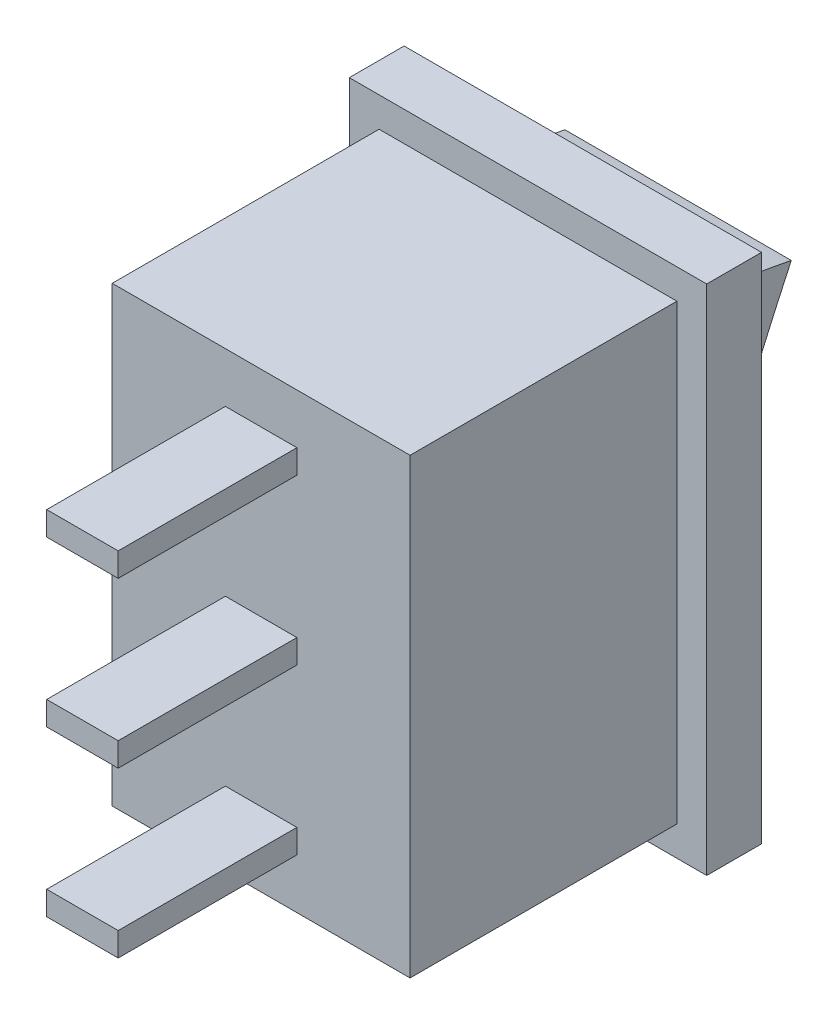
ISO-10303-21;
HEADER;
FILE_DESCRIPTION(('STEP AP214'),'2;1');
FILE_NAME('part.step','',(''),(''),'','','');
FILE_SCHEMA(('AUTOMOTIVE_DESIGN { 1 0 10303 214 1 1 1 1 }'));
ENDSEC;
DATA;
#1=APPLICATION_CONTEXT('core data for automotive mechanical design processes');
#2=APPLICATION_PROTOCOL_DEFINITION('international standard','automotive_design',2000,#1);
#3=PRODUCT_CONTEXT('',#1,'mechanical');
#4=PRODUCT('Part','Part','',(#3));
#5=PRODUCT_RELATED_PRODUCT_CATEGORY('part','',(#4));
#6=PRODUCT_DEFINITION_FORMATION('','',#4);
#7=PRODUCT_DEFINITION_CONTEXT('part definition',#1,'design');
#8=PRODUCT_DEFINITION('design','',#6,#7);
#9=PRODUCT_DEFINITION_SHAPE('','',#8);
#10=(LENGTH_UNIT() NAMED_UNIT(*) SI_UNIT(.MILLI.,.METRE.));
#11=(NAMED_UNIT(*) PLANE_ANGLE_UNIT() SI_UNIT($,.RADIAN.));
#12=(NAMED_UNIT(*) SI_UNIT($,.STERADIAN.) SOLID_ANGLE_UNIT());
#13=UNCERTAINTY_MEASURE_WITH_UNIT(LENGTH_MEASURE(1.E-05),#10,'distance_accuracy_value','');
#14=(GEOMETRIC_REPRESENTATION_CONTEXT(3) GLOBAL_UNCERTAINTY_ASSIGNED_CONTEXT((#13)) GLOBAL_UNIT_ASSIGNED_CONTEXT((#10,
#11,#12)) REPRESENTATION_CONTEXT('',''));
#15=CARTESIAN_POINT('',(0.,0.,0.));
#16=DIRECTION('',(0.,0.,1.));
#17=DIRECTION('',(1.,0.,0.));
#18=AXIS2_PLACEMENT_3D('',#15,#16,#17);
#19=CARTESIAN_POINT('',(-6.25,-9.5,13.5));
#20=DIRECTION('',(0.,0.,1.));
#21=DIRECTION('',(1.,0.,0.));
#22=AXIS2_PLACEMENT_3D('',#19,#20,#21);
#23=PLANE('',#22);
#24=DIRECTION('',(0.,1.,0.));
#25=VECTOR('',#24,1.);
#26=CARTESIAN_POINT('',(1.49999999999998,-7.4,13.5));
#27=LINE('',#26,#25);
#28=CARTESIAN_POINT('',(1.49999999999998,-7.4,13.5));
#29=VERTEX_POINT('',#28);
#30=CARTESIAN_POINT('',(1.49999999999998,-6.4,13.5));
#31=VERTEX_POINT('',#30);
#32=EDGE_CURVE('E225',#29,#31,#27,.T.);
#33=ORIENTED_EDGE('',*,*,#32,.F.);
#34=DIRECTION('',(1.,0.,0.));
#35=VECTOR('',#34,1.);
#36=CARTESIAN_POINT('',(-1.50000000000002,-7.4,13.5));
#37=LINE('',#36,#35);
#38=CARTESIAN_POINT('',(-1.50000000000002,-7.4,13.5));
#39=VERTEX_POINT('',#38);
#40=EDGE_CURVE('E222',#39,#29,#37,.T.);
#41=ORIENTED_EDGE('',*,*,#40,.F.);
#42=DIRECTION('',(0.,-1.,0.));
#43=VECTOR('',#42,1.);
#44=CARTESIAN_POINT('',(-1.50000000000002,-7.4,13.5));
#45=LINE('',#44,#43);
#46=CARTESIAN_POINT('',(-1.50000000000002,-6.4,13.5));
#47=VERTEX_POINT('',#46);
#48=EDGE_CURVE('E234',#47,#39,#45,.T.);
#49=ORIENTED_EDGE('',*,*,#48,.F.);
#50=DIRECTION('',(-1.,0.,0.));
#51=VECTOR('',#50,1.);
#52=CARTESIAN_POINT('',(-1.50000000000002,-6.4,13.5));
#53=LINE('',#52,#51);
#54=EDGE_CURVE('E242',#31,#47,#53,.T.);
#55=ORIENTED_EDGE('',*,*,#54,.F.);
#56=EDGE_LOOP('',(#33,#41,#49,#55));
#57=FACE_BOUND('',#56,.T.);
#58=DIRECTION('',(0.,-1.,0.));
#59=VECTOR('',#58,1.);
#60=CARTESIAN_POINT('',(-6.25,-9.5,13.5));
#61=LINE('',#60,#59);
#62=CARTESIAN_POINT('',(-6.25,9.5,13.5));
#63=VERTEX_POINT('',#62);
#64=CARTESIAN_POINT('',(-6.25,-9.5,13.5));
#65=VERTEX_POINT('',#64);
#66=EDGE_CURVE('E422',#63,#65,#61,.T.);
#67=ORIENTED_EDGE('',*,*,#66,.T.);
#68=DIRECTION('',(1.,0.,0.));
#69=VECTOR('',#68,1.);
#70=CARTESIAN_POINT('',(6.25000000000001,-9.5,13.5));
#71=LINE('',#70,#69);
#72=CARTESIAN_POINT('',(6.25000000000001,-9.5,13.5));
#73=VERTEX_POINT('',#72);
#74=EDGE_CURVE('E431',#65,#73,#71,.T.);
#75=ORIENTED_EDGE('',*,*,#74,.T.);
#76=DIRECTION('',(0.,1.,0.));
#77=VECTOR('',#76,1.);
#78=CARTESIAN_POINT('',(6.25,9.5,13.5));
#79=LINE('',#78,#77);
#80=CARTESIAN_POINT('',(6.25,9.5,13.5));
#81=VERTEX_POINT('',#80);
#82=EDGE_CURVE('E430',#73,#81,#79,.T.);
#83=ORIENTED_EDGE('',*,*,#82,.T.);
#84=DIRECTION('',(-1.,0.,0.));
#85=VECTOR('',#84,1.);
#86=CARTESIAN_POINT('',(-6.25,9.5,13.5));
#87=LINE('',#86,#85);
#88=EDGE_CURVE('E425',#81,#63,#87,.T.);
#89=ORIENTED_EDGE('',*,*,#88,.T.);
#90=EDGE_LOOP('',(#67,#75,#83,#89));
#91=FACE_BOUND('',#90,.T.);
#92=DIRECTION('',(1.,0.,0.));
#93=VECTOR('',#92,1.);
#94=CARTESIAN_POINT('',(-1.5,-0.5,13.5));
#95=LINE('',#94,#93);
#96=CARTESIAN_POINT('',(-1.5,-0.5,13.5));
#97=VERTEX_POINT('',#96);
#98=CARTESIAN_POINT('',(1.5,-0.5,13.5));
#99=VERTEX_POINT('',#98);
#100=EDGE_CURVE('E267',#97,#99,#95,.T.);
#101=ORIENTED_EDGE('',*,*,#100,.F.);
#102=DIRECTION('',(0.,-1.,0.));
#103=VECTOR('',#102,1.);
#104=CARTESIAN_POINT('',(-1.5,0.5,13.5));
#105=LINE('',#104,#103);
#106=CARTESIAN_POINT('',(-1.5,0.5,13.5));
#107=VERTEX_POINT('',#106);
#108=EDGE_CURVE('E253',#107,#97,#105,.T.);
#109=ORIENTED_EDGE('',*,*,#108,.F.);
#110=DIRECTION('',(-1.,0.,0.));
#111=VECTOR('',#110,1.);
#112=CARTESIAN_POINT('',(-1.5,0.5,13.5));
#113=LINE('',#112,#111);
#114=CARTESIAN_POINT('',(1.5,0.500000000000001,13.5));
#115=VERTEX_POINT('',#114);
#116=EDGE_CURVE('E258',#115,#107,#113,.T.);
#117=ORIENTED_EDGE('',*,*,#116,.F.);
#118=DIRECTION('',(0.,1.,0.));
#119=VECTOR('',#118,1.);
#120=CARTESIAN_POINT('',(1.5,0.5,13.5));
#121=LINE('',#120,#119);
#122=EDGE_CURVE('E269',#99,#115,#121,.T.);
#123=ORIENTED_EDGE('',*,*,#122,.F.);
#124=EDGE_LOOP('',(#101,#109,#117,#123));
#125=FACE_BOUND('',#124,.T.);
#126=DIRECTION('',(1.,0.,0.));
#127=VECTOR('',#126,1.);
#128=CARTESIAN_POINT('',(-1.50000000000002,6.4,13.5));
#129=LINE('',#128,#127);
#130=CARTESIAN_POINT('',(-1.50000000000002,6.4,13.5));
#131=VERTEX_POINT('',#130);
#132=CARTESIAN_POINT('',(1.49999999999998,6.4,13.5));
#133=VERTEX_POINT('',#132);
#134=EDGE_CURVE('E501',#131,#133,#129,.T.);
#135=ORIENTED_EDGE('',*,*,#134,.F.);
#136=DIRECTION('',(0.,-1.,0.));
#137=VECTOR('',#136,1.);
#138=CARTESIAN_POINT('',(-1.50000000000002,7.4,13.5));
#139=LINE('',#138,#137);
#140=CARTESIAN_POINT('',(-1.50000000000002,7.4,13.5));
#141=VERTEX_POINT('',#140);
#142=EDGE_CURVE('E220',#141,#131,#139,.T.);
#143=ORIENTED_EDGE('',*,*,#142,.F.);
#144=DIRECTION('',(-1.,0.,0.));
#145=VECTOR('',#144,1.);
#146=CARTESIAN_POINT('',(-1.50000000000002,7.4,13.5));
#147=LINE('',#146,#145);
#148=CARTESIAN_POINT('',(1.49999999999998,7.4,13.5));
#149=VERTEX_POINT('',#148);
#150=EDGE_CURVE('E216',#149,#141,#147,.T.);
#151=ORIENTED_EDGE('',*,*,#150,.F.);
#152=DIRECTION('',(0.,1.,0.));
#153=VECTOR('',#152,1.);
#154=CARTESIAN_POINT('',(1.49999999999998,7.4,13.5));
#155=LINE('',#154,#153);
#156=EDGE_CURVE('E503',#133,#149,#155,.T.);
#157=ORIENTED_EDGE('',*,*,#156,.F.);
#158=EDGE_LOOP('',(#135,#143,#151,#157));
#159=FACE_BOUND('',#158,.T.);
#160=ADVANCED_FACE('F35',(#57,#91,#125,#159),#23,.T.);
#161=CARTESIAN_POINT('',(4.75,7.5,-4.));
#162=DIRECTION('',(-1.,0.,0.));
#163=DIRECTION('',(0.,-1.,0.));
#164=AXIS2_PLACEMENT_3D('',#161,#162,#163);
#165=PLANE('',#164);
#166=CARTESIAN_POINT('',(4.75,-7.5,-0.355698538172021));
#167=CARTESIAN_POINT('',(4.75,-7.20358473254136,-0.354349181532763));
#168=CARTESIAN_POINT('',(4.75,-4.68700606925858,-0.342893084292468));
#169=CARTESIAN_POINT('',(4.75,0.423075598671808,-0.90591646987989));
#170=CARTESIAN_POINT('',(4.75,4.76511014941746,-2.92374207641146));
#171=CARTESIAN_POINT('',(4.75,7.08104323828726,-4.));
#172=B_SPLINE_CURVE_WITH_KNOTS('',3,(#166,#167,#168,#169,#170,#171),.UNSPECIFIED.,.F.,.F.,(4,1,
1,4),(0.,0.0586457613073711,0.497905093969898,1.),.UNSPECIFIED.);
#173=CARTESIAN_POINT('',(4.75,7.08104323828726,-4.));
#174=VERTEX_POINT('',#173);
#175=CARTESIAN_POINT('',(4.74999999999999,-7.5,-0.355698538172021));
#176=VERTEX_POINT('',#175);
#177=EDGE_CURVE('E455',#174,#176,#172,.F.);
#178=ORIENTED_EDGE('',*,*,#177,.F.);
#179=CARTESIAN_POINT('',(4.75,7.08104323828726,-4.));
#180=CARTESIAN_POINT('',(4.75,7.19501669015073,-3.41831864187691));
#181=CARTESIAN_POINT('',(4.75,7.45366483827933,-2.09826731747113));
#182=CARTESIAN_POINT('',(4.75,7.48337925673809,-0.75266301192165));
#183=CARTESIAN_POINT('',(4.75,7.5,0.));
#184=B_SPLINE_CURVE_WITH_KNOTS('',3,(#179,#180,#181,#182,#183),.UNSPECIFIED.,.F.,.F.,(4,1,4),
(0.,0.440650562117295,1.),.UNSPECIFIED.);
#185=CARTESIAN_POINT('',(4.75,7.5,0.));
#186=VERTEX_POINT('',#185);
#187=EDGE_CURVE('E468',#186,#174,#184,.F.);
#188=ORIENTED_EDGE('',*,*,#187,.F.);
#189=DIRECTION('',(0.,-1.,0.));
#190=VECTOR('',#189,1.);
#191=CARTESIAN_POINT('',(4.75,7.5,0.));
#192=LINE('',#191,#190);
#193=CARTESIAN_POINT('',(4.74999999999999,-7.5,0.));
#194=VERTEX_POINT('',#193);
#195=EDGE_CURVE('E452',#186,#194,#192,.T.);
#196=ORIENTED_EDGE('',*,*,#195,.T.);
#197=DIRECTION('',(0.,0.,1.));
#198=VECTOR('',#197,1.);
#199=CARTESIAN_POINT('',(4.74999999999999,-7.5,-4.));
#200=LINE('',#199,#198);
#201=EDGE_CURVE('E417',#176,#194,#200,.T.);
#202=ORIENTED_EDGE('',*,*,#201,.F.);
#203=EDGE_LOOP('',(#178,#188,#196,#202));
#204=FACE_BOUND('',#203,.T.);
#205=ADVANCED_FACE('F315',(#204),#165,.F.);
#206=CARTESIAN_POINT('',(4.74999999999999,-7.5,-4.));
#207=DIRECTION('',(0.,1.,0.));
#208=DIRECTION('',(-1.,0.,0.));
#209=AXIS2_PLACEMENT_3D('',#206,#207,#208);
#210=PLANE('',#209);
#211=DIRECTION('',(1.,0.,0.));
#212=VECTOR('',#211,1.);
#213=CARTESIAN_POINT('',(-47.5872937811862,-7.49999999999999,-0.355698538172021));
#214=LINE('',#213,#212);
#215=CARTESIAN_POINT('',(-4.75,-7.5,-0.355698538172021));
#216=VERTEX_POINT('',#215);
#217=EDGE_CURVE('E484',#216,#176,#214,.T.);
#218=ORIENTED_EDGE('',*,*,#217,.T.);
#219=ORIENTED_EDGE('',*,*,#201,.T.);
#220=DIRECTION('',(-1.,0.,0.));
#221=VECTOR('',#220,1.);
#222=CARTESIAN_POINT('',(4.74999999999999,-7.5,0.));
#223=LINE('',#222,#221);
#224=CARTESIAN_POINT('',(-4.75,-7.5,0.));
#225=VERTEX_POINT('',#224);
#226=EDGE_CURVE('E449',#194,#225,#223,.T.);
#227=ORIENTED_EDGE('',*,*,#226,.T.);
#228=DIRECTION('',(0.,0.,1.));
#229=VECTOR('',#228,1.);
#230=CARTESIAN_POINT('',(-4.75,-7.5,-4.));
#231=LINE('',#230,#229);
#232=EDGE_CURVE('E441',#216,#225,#231,.T.);
#233=ORIENTED_EDGE('',*,*,#232,.F.);
#234=EDGE_LOOP('',(#218,#219,#227,#233));
#235=FACE_BOUND('',#234,.T.);
#236=ADVANCED_FACE('F311',(#235),#210,.F.);
#237=CARTESIAN_POINT('',(-4.75,7.5,-4.));
#238=DIRECTION('',(1.,0.,0.));
#239=DIRECTION('',(0.,1.,0.));
#240=AXIS2_PLACEMENT_3D('',#237,#238,#239);
#241=PLANE('',#240);
#242=CARTESIAN_POINT('',(-4.75,-7.5,-0.355698538172021));
#243=CARTESIAN_POINT('',(-4.75,-7.20358473254136,-0.354349181532763));
#244=CARTESIAN_POINT('',(-4.75,-4.68700606925858,-0.342893084292468));
#245=CARTESIAN_POINT('',(-4.75,0.423075598671809,-0.90591646987989));
#246=CARTESIAN_POINT('',(-4.75,4.76511014941746,-2.92374207641146));
#247=CARTESIAN_POINT('',(-4.75,7.08104323828726,-4.));
#248=B_SPLINE_CURVE_WITH_KNOTS('',3,(#242,#243,#244,#245,#246,#247),.UNSPECIFIED.,.F.,.F.,(4,1,
1,4),(0.,0.0586457613073711,0.497905093969898,1.),.UNSPECIFIED.);
#249=CARTESIAN_POINT('',(-4.75,7.08104323828726,-4.));
#250=VERTEX_POINT('',#249);
#251=EDGE_CURVE('E460',#216,#250,#248,.T.);
#252=ORIENTED_EDGE('',*,*,#251,.F.);
#253=ORIENTED_EDGE('',*,*,#232,.T.);
#254=DIRECTION('',(0.,1.,0.));
#255=VECTOR('',#254,1.);
#256=CARTESIAN_POINT('',(-4.75,7.5,0.));
#257=LINE('',#256,#255);
#258=CARTESIAN_POINT('',(-4.75,7.5,0.));
#259=VERTEX_POINT('',#258);
#260=EDGE_CURVE('E446',#225,#259,#257,.T.);
#261=ORIENTED_EDGE('',*,*,#260,.T.);
#262=CARTESIAN_POINT('',(-4.75,7.08104323828726,-4.));
#263=CARTESIAN_POINT('',(-4.75,7.19501669015073,-3.41831864187691));
#264=CARTESIAN_POINT('',(-4.75,7.45366483827933,-2.09826731747113));
#265=CARTESIAN_POINT('',(-4.75,7.48337925673809,-0.75266301192165));
#266=CARTESIAN_POINT('',(-4.75,7.5,0.));
#267=B_SPLINE_CURVE_WITH_KNOTS('',3,(#262,#263,#264,#265,#266),.UNSPECIFIED.,.F.,.F.,(4,1,4),
(0.,0.440650562117295,1.),.UNSPECIFIED.);
#268=EDGE_CURVE('E476',#250,#259,#267,.T.);
#269=ORIENTED_EDGE('',*,*,#268,.F.);
#270=EDGE_LOOP('',(#252,#253,#261,#269));
#271=FACE_BOUND('',#270,.T.);
#272=ADVANCED_FACE('F307',(#271),#241,.F.);
#273=CARTESIAN_POINT('',(-7.5,-10.75,0.));
#274=DIRECTION('',(0.,0.,1.));
#275=DIRECTION('',(1.,0.,0.));
#276=AXIS2_PLACEMENT_3D('',#273,#274,#275);
#277=PLANE('',#276);
#278=ORIENTED_EDGE('',*,*,#195,.F.);
#279=DIRECTION('',(1.,0.,0.));
#280=VECTOR('',#279,1.);
#281=CARTESIAN_POINT('',(4.75,7.5,0.));
#282=LINE('',#281,#280);
#283=EDGE_CURVE('E443',#259,#186,#282,.T.);
#284=ORIENTED_EDGE('',*,*,#283,.F.);
#285=ORIENTED_EDGE('',*,*,#260,.F.);
#286=ORIENTED_EDGE('',*,*,#226,.F.);
#287=EDGE_LOOP('',(#278,#284,#285,#286));
#288=FACE_BOUND('',#287,.T.);
#289=DIRECTION('',(-1.,0.,0.));
#290=VECTOR('',#289,1.);
#291=CARTESIAN_POINT('',(-7.5,10.75,0.));
#292=LINE('',#291,#290);
#293=CARTESIAN_POINT('',(7.5,10.75,0.));
#294=VERTEX_POINT('',#293);
#295=CARTESIAN_POINT('',(-7.5,10.75,0.));
#296=VERTEX_POINT('',#295);
#297=EDGE_CURVE('E376',#294,#296,#292,.T.);
#298=ORIENTED_EDGE('',*,*,#297,.F.);
#299=DIRECTION('',(0.,1.,0.));
#300=VECTOR('',#299,1.);
#301=CARTESIAN_POINT('',(7.5,10.75,0.));
#302=LINE('',#301,#300);
#303=CARTESIAN_POINT('',(7.50000000000002,-10.75,0.));
#304=VERTEX_POINT('',#303);
#305=EDGE_CURVE('E368',#304,#294,#302,.T.);
#306=ORIENTED_EDGE('',*,*,#305,.F.);
#307=DIRECTION('',(1.,0.,0.));
#308=VECTOR('',#307,1.);
#309=CARTESIAN_POINT('',(7.50000000000002,-10.75,0.));
#310=LINE('',#309,#308);
#311=CARTESIAN_POINT('',(-7.5,-10.75,0.));
#312=VERTEX_POINT('',#311);
#313=EDGE_CURVE('E361',#312,#304,#310,.T.);
#314=ORIENTED_EDGE('',*,*,#313,.F.);
#315=DIRECTION('',(0.,-1.,0.));
#316=VECTOR('',#315,1.);
#317=CARTESIAN_POINT('',(-7.5,-10.75,0.));
#318=LINE('',#317,#316);
#319=EDGE_CURVE('E369',#296,#312,#318,.T.);
#320=ORIENTED_EDGE('',*,*,#319,.F.);
#321=EDGE_LOOP('',(#298,#306,#314,#320));
#322=FACE_BOUND('',#321,.T.);
#323=ADVANCED_FACE('F310',(#288,#322),#277,.F.);
#324=CARTESIAN_POINT('',(-7.5,-10.75,2.3));
#325=DIRECTION('',(0.,0.,1.));
#326=DIRECTION('',(1.,0.,0.));
#327=AXIS2_PLACEMENT_3D('',#324,#325,#326);
#328=PLANE('',#327);
#329=DIRECTION('',(0.,-1.,0.));
#330=VECTOR('',#329,1.);
#331=CARTESIAN_POINT('',(-7.5,-10.75,2.3));
#332=LINE('',#331,#330);
#333=CARTESIAN_POINT('',(-7.5,10.75,2.3));
#334=VERTEX_POINT('',#333);
#335=CARTESIAN_POINT('',(-7.5,-10.75,2.3));
#336=VERTEX_POINT('',#335);
#337=EDGE_CURVE('E378',#334,#336,#332,.T.);
#338=ORIENTED_EDGE('',*,*,#337,.T.);
#339=DIRECTION('',(1.,0.,0.));
#340=VECTOR('',#339,1.);
#341=CARTESIAN_POINT('',(7.50000000000002,-10.75,2.3));
#342=LINE('',#341,#340);
#343=CARTESIAN_POINT('',(7.50000000000002,-10.75,2.3));
#344=VERTEX_POINT('',#343);
#345=EDGE_CURVE('E391',#336,#344,#342,.T.);
#346=ORIENTED_EDGE('',*,*,#345,.T.);
#347=DIRECTION('',(0.,1.,0.));
#348=VECTOR('',#347,1.);
#349=CARTESIAN_POINT('',(7.5,10.75,2.3));
#350=LINE('',#349,#348);
#351=CARTESIAN_POINT('',(7.5,10.75,2.3));
#352=VERTEX_POINT('',#351);
#353=EDGE_CURVE('E373',#344,#352,#350,.T.);
#354=ORIENTED_EDGE('',*,*,#353,.T.);
#355=DIRECTION('',(-1.,0.,0.));
#356=VECTOR('',#355,1.);
#357=CARTESIAN_POINT('',(-7.5,10.75,2.3));
#358=LINE('',#357,#356);
#359=EDGE_CURVE('E385',#352,#334,#358,.T.);
#360=ORIENTED_EDGE('',*,*,#359,.T.);
#361=EDGE_LOOP('',(#338,#346,#354,#360));
#362=FACE_BOUND('',#361,.T.);
#363=DIRECTION('',(1.,0.,0.));
#364=VECTOR('',#363,1.);
#365=CARTESIAN_POINT('',(6.25000000000001,-9.5,2.3));
#366=LINE('',#365,#364);
#367=CARTESIAN_POINT('',(-6.25,-9.5,2.3));
#368=VERTEX_POINT('',#367);
#369=CARTESIAN_POINT('',(6.25000000000001,-9.5,2.3));
#370=VERTEX_POINT('',#369);
#371=EDGE_CURVE('E408',#368,#370,#366,.T.);
#372=ORIENTED_EDGE('',*,*,#371,.F.);
#373=DIRECTION('',(0.,-1.,0.));
#374=VECTOR('',#373,1.);
#375=CARTESIAN_POINT('',(-6.25,-9.5,2.3));
#376=LINE('',#375,#374);
#377=CARTESIAN_POINT('',(-6.25,9.5,2.3));
#378=VERTEX_POINT('',#377);
#379=EDGE_CURVE('E410',#378,#368,#376,.T.);
#380=ORIENTED_EDGE('',*,*,#379,.F.);
#381=DIRECTION('',(-1.,0.,0.));
#382=VECTOR('',#381,1.);
#383=CARTESIAN_POINT('',(-6.25,9.5,2.3));
#384=LINE('',#383,#382);
#385=CARTESIAN_POINT('',(6.25,9.5,2.3));
#386=VERTEX_POINT('',#385);
#387=EDGE_CURVE('E415',#386,#378,#384,.T.);
#388=ORIENTED_EDGE('',*,*,#387,.F.);
#389=DIRECTION('',(0.,1.,0.));
#390=VECTOR('',#389,1.);
#391=CARTESIAN_POINT('',(6.25,9.5,2.3));
#392=LINE('',#391,#390);
#393=EDGE_CURVE('E412',#370,#386,#392,.T.);
#394=ORIENTED_EDGE('',*,*,#393,.F.);
#395=EDGE_LOOP('',(#372,#380,#388,#394));
#396=FACE_BOUND('',#395,.T.);
#397=ADVANCED_FACE('F339',(#362,#396),#328,.T.);
#398=CARTESIAN_POINT('',(-7.5,-10.75,2.3));
#399=DIRECTION('',(1.,0.,0.));
#400=DIRECTION('',(0.,1.,0.));
#401=AXIS2_PLACEMENT_3D('',#398,#399,#400);
#402=PLANE('',#401);
#403=ORIENTED_EDGE('',*,*,#319,.T.);
#404=DIRECTION('',(0.,0.,-1.));
#405=VECTOR('',#404,1.);
#406=CARTESIAN_POINT('',(-7.5,-10.75,2.3));
#407=LINE('',#406,#405);
#408=EDGE_CURVE('E11',#336,#312,#407,.T.);
#409=ORIENTED_EDGE('',*,*,#408,.F.);
#410=ORIENTED_EDGE('',*,*,#337,.F.);
#411=DIRECTION('',(0.,0.,-1.));
#412=VECTOR('',#411,1.);
#413=CARTESIAN_POINT('',(-7.5,10.75,2.3));
#414=LINE('',#413,#412);
#415=EDGE_CURVE('E382',#334,#296,#414,.T.);
#416=ORIENTED_EDGE('',*,*,#415,.T.);
#417=EDGE_LOOP('',(#403,#409,#410,#416));
#418=FACE_BOUND('',#417,.T.);
#419=ADVANCED_FACE('F37',(#418),#402,.F.);
#420=CARTESIAN_POINT('',(7.50000000000002,-10.75,2.3));
#421=DIRECTION('',(0.,1.,0.));
#422=DIRECTION('',(-1.,0.,0.));
#423=AXIS2_PLACEMENT_3D('',#420,#421,#422);
#424=PLANE('',#423);
#425=ORIENTED_EDGE('',*,*,#313,.T.);
#426=DIRECTION('',(0.,0.,-1.));
#427=VECTOR('',#426,1.);
#428=CARTESIAN_POINT('',(7.50000000000002,-10.75,2.3));
#429=LINE('',#428,#427);
#430=EDGE_CURVE('E43',#344,#304,#429,.T.);
#431=ORIENTED_EDGE('',*,*,#430,.F.);
#432=ORIENTED_EDGE('',*,*,#345,.F.);
#433=ORIENTED_EDGE('',*,*,#408,.T.);
#434=EDGE_LOOP('',(#425,#431,#432,#433));
#435=FACE_BOUND('',#434,.T.);
#436=ADVANCED_FACE('F351',(#435),#424,.F.);
#437=CARTESIAN_POINT('',(7.5,10.75,2.3));
#438=DIRECTION('',(-1.,0.,0.));
#439=DIRECTION('',(0.,-1.,0.));
#440=AXIS2_PLACEMENT_3D('',#437,#438,#439);
#441=PLANE('',#440);
#442=ORIENTED_EDGE('',*,*,#305,.T.);
#443=DIRECTION('',(0.,0.,-1.));
#444=VECTOR('',#443,1.);
#445=CARTESIAN_POINT('',(7.5,10.75,2.3));
#446=LINE('',#445,#444);
#447=EDGE_CURVE('E374',#352,#294,#446,.T.);
#448=ORIENTED_EDGE('',*,*,#447,.F.);
#449=ORIENTED_EDGE('',*,*,#353,.F.);
#450=ORIENTED_EDGE('',*,*,#430,.T.);
#451=EDGE_LOOP('',(#442,#448,#449,#450));
#452=FACE_BOUND('',#451,.T.);
#453=ADVANCED_FACE('F348',(#452),#441,.F.);
#454=CARTESIAN_POINT('',(-7.5,10.75,2.3));
#455=DIRECTION('',(0.,-1.,0.));
#456=DIRECTION('',(1.,0.,0.));
#457=AXIS2_PLACEMENT_3D('',#454,#455,#456);
#458=PLANE('',#457);
#459=ORIENTED_EDGE('',*,*,#297,.T.);
#460=ORIENTED_EDGE('',*,*,#415,.F.);
#461=ORIENTED_EDGE('',*,*,#359,.F.);
#462=ORIENTED_EDGE('',*,*,#447,.T.);
#463=EDGE_LOOP('',(#459,#460,#461,#462));
#464=FACE_BOUND('',#463,.T.);
#465=ADVANCED_FACE('F337',(#464),#458,.F.);
#466=CARTESIAN_POINT('',(-6.25,-9.5,13.5));
#467=DIRECTION('',(1.,0.,0.));
#468=DIRECTION('',(0.,1.,0.));
#469=AXIS2_PLACEMENT_3D('',#466,#467,#468);
#470=PLANE('',#469);
#471=ORIENTED_EDGE('',*,*,#379,.T.);
#472=DIRECTION('',(0.,0.,-1.));
#473=VECTOR('',#472,1.);
#474=CARTESIAN_POINT('',(-6.25,-9.5,13.5));
#475=LINE('',#474,#473);
#476=EDGE_CURVE('E394',#65,#368,#475,.T.);
#477=ORIENTED_EDGE('',*,*,#476,.F.);
#478=ORIENTED_EDGE('',*,*,#66,.F.);
#479=DIRECTION('',(0.,0.,-1.));
#480=VECTOR('',#479,1.);
#481=CARTESIAN_POINT('',(-6.25,9.5,13.5));
#482=LINE('',#481,#480);
#483=EDGE_CURVE('E423',#63,#378,#482,.T.);
#484=ORIENTED_EDGE('',*,*,#483,.T.);
#485=EDGE_LOOP('',(#471,#477,#478,#484));
#486=FACE_BOUND('',#485,.T.);
#487=ADVANCED_FACE('F333',(#486),#470,.F.);
#488=CARTESIAN_POINT('',(6.25000000000001,-9.5,13.5));
#489=DIRECTION('',(0.,1.,0.));
#490=DIRECTION('',(-1.,0.,0.));
#491=AXIS2_PLACEMENT_3D('',#488,#489,#490);
#492=PLANE('',#491);
#493=ORIENTED_EDGE('',*,*,#371,.T.);
#494=DIRECTION('',(0.,0.,-1.));
#495=VECTOR('',#494,1.);
#496=CARTESIAN_POINT('',(6.25000000000001,-9.5,13.5));
#497=LINE('',#496,#495);
#498=EDGE_CURVE('E395',#73,#370,#497,.T.);
#499=ORIENTED_EDGE('',*,*,#498,.F.);
#500=ORIENTED_EDGE('',*,*,#74,.F.);
#501=ORIENTED_EDGE('',*,*,#476,.T.);
#502=EDGE_LOOP('',(#493,#499,#500,#501));
#503=FACE_BOUND('',#502,.T.);
#504=ADVANCED_FACE('F329',(#503),#492,.F.);
#505=CARTESIAN_POINT('',(6.25,9.5,13.5));
#506=DIRECTION('',(-1.,0.,0.));
#507=DIRECTION('',(0.,-1.,0.));
#508=AXIS2_PLACEMENT_3D('',#505,#506,#507);
#509=PLANE('',#508);
#510=ORIENTED_EDGE('',*,*,#393,.T.);
#511=DIRECTION('',(0.,0.,-1.));
#512=VECTOR('',#511,1.);
#513=CARTESIAN_POINT('',(6.25,9.5,13.5));
#514=LINE('',#513,#512);
#515=EDGE_CURVE('E400',#81,#386,#514,.T.);
#516=ORIENTED_EDGE('',*,*,#515,.F.);
#517=ORIENTED_EDGE('',*,*,#82,.F.);
#518=ORIENTED_EDGE('',*,*,#498,.T.);
#519=EDGE_LOOP('',(#510,#516,#517,#518));
#520=FACE_BOUND('',#519,.T.);
#521=ADVANCED_FACE('F325',(#520),#509,.F.);
#522=CARTESIAN_POINT('',(-6.25,9.5,13.5));
#523=DIRECTION('',(0.,-1.,0.));
#524=DIRECTION('',(1.,0.,0.));
#525=AXIS2_PLACEMENT_3D('',#522,#523,#524);
#526=PLANE('',#525);
#527=ORIENTED_EDGE('',*,*,#387,.T.);
#528=ORIENTED_EDGE('',*,*,#483,.F.);
#529=ORIENTED_EDGE('',*,*,#88,.F.);
#530=ORIENTED_EDGE('',*,*,#515,.T.);
#531=EDGE_LOOP('',(#527,#528,#529,#530));
#532=FACE_BOUND('',#531,.T.);
#533=ADVANCED_FACE('F305',(#532),#526,.F.);
#534=CARTESIAN_POINT('',(-47.5872937811862,-7.49999999999999,-0.355698538172021));
#535=CARTESIAN_POINT('',(-47.5872937811862,-7.20358473254136,-0.354349181532763));
#536=CARTESIAN_POINT('',(-47.5872937811862,-4.68700606925858,-0.342893084292468));
#537=CARTESIAN_POINT('',(-47.5872937811862,0.423075598671814,-0.90591646987989));
#538=CARTESIAN_POINT('',(-47.5872937811862,4.76511014941747,-2.92374207641146));
#539=CARTESIAN_POINT('',(-47.5872937811862,7.08104323828727,-4.));
#540=B_SPLINE_CURVE_WITH_KNOTS('',3,(#534,#535,#536,#537,#538,#539),.UNSPECIFIED.,.F.,.F.,(4,1,
1,4),(0.,0.0586457613073711,0.497905093969898,1.),.UNSPECIFIED.);
#541=DIRECTION('',(1.,0.,0.));
#542=VECTOR('',#541,1.);
#543=SURFACE_OF_LINEAR_EXTRUSION('',#540,#542);
#544=DIRECTION('',(1.,0.,0.));
#545=VECTOR('',#544,1.);
#546=CARTESIAN_POINT('',(-47.5872937811862,7.08104323828727,-4.));
#547=LINE('',#546,#545);
#548=EDGE_CURVE('E282',#250,#174,#547,.T.);
#549=ORIENTED_EDGE('',*,*,#548,.T.);
#550=ORIENTED_EDGE('',*,*,#177,.T.);
#551=ORIENTED_EDGE('',*,*,#217,.F.);
#552=ORIENTED_EDGE('',*,*,#251,.T.);
#553=EDGE_LOOP('',(#549,#550,#551,#552));
#554=FACE_BOUND('',#553,.T.);
#555=ADVANCED_FACE('F300',(#554),#543,.T.);
#556=CARTESIAN_POINT('',(-47.5872937811862,7.08104323828727,-4.));
#557=CARTESIAN_POINT('',(-47.5872937811862,7.19501669015073,-3.41831864187691));
#558=CARTESIAN_POINT('',(-47.5872937811862,7.45366483827934,-2.09826731747113));
#559=CARTESIAN_POINT('',(-47.5872937811862,7.48337925673809,-0.75266301192165));
#560=CARTESIAN_POINT('',(-47.5872937811862,7.50000000000001,0.));
#561=B_SPLINE_CURVE_WITH_KNOTS('',3,(#556,#557,#558,#559,#560),.UNSPECIFIED.,.F.,.F.,(4,1,4),
(0.,0.440650562117295,1.),.UNSPECIFIED.);
#562=DIRECTION('',(1.,0.,0.));
#563=VECTOR('',#562,1.);
#564=SURFACE_OF_LINEAR_EXTRUSION('',#561,#563);
#565=ORIENTED_EDGE('',*,*,#283,.T.);
#566=ORIENTED_EDGE('',*,*,#187,.T.);
#567=ORIENTED_EDGE('',*,*,#548,.F.);
#568=ORIENTED_EDGE('',*,*,#268,.T.);
#569=EDGE_LOOP('',(#565,#566,#567,#568));
#570=FACE_BOUND('',#569,.T.);
#571=ADVANCED_FACE('F295',(#570),#564,.T.);
#572=CARTESIAN_POINT('',(-1.5,0.5,21.));
#573=DIRECTION('',(1.,0.,0.));
#574=DIRECTION('',(0.,0.,-1.));
#575=AXIS2_PLACEMENT_3D('',#572,#573,#574);
#576=PLANE('',#575);
#577=ORIENTED_EDGE('',*,*,#108,.T.);
#578=DIRECTION('',(0.,0.,-1.));
#579=VECTOR('',#578,1.);
#580=CARTESIAN_POINT('',(-1.5,-0.5,21.));
#581=LINE('',#580,#579);
#582=CARTESIAN_POINT('',(-1.5,-0.5,21.));
#583=VERTEX_POINT('',#582);
#584=EDGE_CURVE('E280',#583,#97,#581,.T.);
#585=ORIENTED_EDGE('',*,*,#584,.F.);
#586=DIRECTION('',(0.,-1.,0.));
#587=VECTOR('',#586,1.);
#588=CARTESIAN_POINT('',(-1.5,0.5,21.));
#589=LINE('',#588,#587);
#590=CARTESIAN_POINT('',(-1.5,0.5,21.));
#591=VERTEX_POINT('',#590);
#592=EDGE_CURVE('E254',#591,#583,#589,.T.);
#593=ORIENTED_EDGE('',*,*,#592,.F.);
#594=DIRECTION('',(0.,0.,-1.));
#595=VECTOR('',#594,1.);
#596=CARTESIAN_POINT('',(-1.5,0.5,21.));
#597=LINE('',#596,#595);
#598=EDGE_CURVE('E264',#591,#107,#597,.T.);
#599=ORIENTED_EDGE('',*,*,#598,.T.);
#600=EDGE_LOOP('',(#577,#585,#593,#599));
#601=FACE_BOUND('',#600,.T.);
#602=ADVANCED_FACE('F299',(#601),#576,.F.);
#603=CARTESIAN_POINT('',(-1.5,-0.5,21.));
#604=DIRECTION('',(0.,1.,0.));
#605=DIRECTION('',(-1.,0.,0.));
#606=AXIS2_PLACEMENT_3D('',#603,#604,#605);
#607=PLANE('',#606);
#608=ORIENTED_EDGE('',*,*,#100,.T.);
#609=DIRECTION('',(0.,0.,-1.));
#610=VECTOR('',#609,1.);
#611=CARTESIAN_POINT('',(1.5,-0.5,21.));
#612=LINE('',#611,#610);
#613=CARTESIAN_POINT('',(1.5,-0.5,21.));
#614=VERTEX_POINT('',#613);
#615=EDGE_CURVE('E277',#614,#99,#612,.T.);
#616=ORIENTED_EDGE('',*,*,#615,.F.);
#617=DIRECTION('',(1.,0.,0.));
#618=VECTOR('',#617,1.);
#619=CARTESIAN_POINT('',(-1.5,-0.5,21.));
#620=LINE('',#619,#618);
#621=EDGE_CURVE('E257',#583,#614,#620,.T.);
#622=ORIENTED_EDGE('',*,*,#621,.F.);
#623=ORIENTED_EDGE('',*,*,#584,.T.);
#624=EDGE_LOOP('',(#608,#616,#622,#623));
#625=FACE_BOUND('',#624,.T.);
#626=ADVANCED_FACE('F557',(#625),#607,.F.);
#627=CARTESIAN_POINT('',(1.5,0.5,21.));
#628=DIRECTION('',(-1.,0.,0.));
#629=DIRECTION('',(0.,-1.,0.));
#630=AXIS2_PLACEMENT_3D('',#627,#628,#629);
#631=PLANE('',#630);
#632=ORIENTED_EDGE('',*,*,#122,.T.);
#633=DIRECTION('',(0.,0.,-1.));
#634=VECTOR('',#633,1.);
#635=CARTESIAN_POINT('',(1.5,0.5,21.));
#636=LINE('',#635,#634);
#637=CARTESIAN_POINT('',(1.5,0.5,21.));
#638=VERTEX_POINT('',#637);
#639=EDGE_CURVE('E275',#638,#115,#636,.T.);
#640=ORIENTED_EDGE('',*,*,#639,.F.);
#641=DIRECTION('',(0.,1.,0.));
#642=VECTOR('',#641,1.);
#643=CARTESIAN_POINT('',(1.5,0.5,21.));
#644=LINE('',#643,#642);
#645=EDGE_CURVE('E260',#614,#638,#644,.T.);
#646=ORIENTED_EDGE('',*,*,#645,.F.);
#647=ORIENTED_EDGE('',*,*,#615,.T.);
#648=EDGE_LOOP('',(#632,#640,#646,#647));
#649=FACE_BOUND('',#648,.T.);
#650=ADVANCED_FACE('F554',(#649),#631,.F.);
#651=CARTESIAN_POINT('',(-1.5,0.5,21.));
#652=DIRECTION('',(0.,-1.,0.));
#653=DIRECTION('',(1.,0.,0.));
#654=AXIS2_PLACEMENT_3D('',#651,#652,#653);
#655=PLANE('',#654);
#656=ORIENTED_EDGE('',*,*,#116,.T.);
#657=ORIENTED_EDGE('',*,*,#598,.F.);
#658=DIRECTION('',(-1.,0.,0.));
#659=VECTOR('',#658,1.);
#660=CARTESIAN_POINT('',(-1.5,0.5,21.));
#661=LINE('',#660,#659);
#662=EDGE_CURVE('E262',#638,#591,#661,.T.);
#663=ORIENTED_EDGE('',*,*,#662,.F.);
#664=ORIENTED_EDGE('',*,*,#639,.T.);
#665=EDGE_LOOP('',(#656,#657,#663,#664));
#666=FACE_BOUND('',#665,.T.);
#667=ADVANCED_FACE('F550',(#666),#655,.F.);
#668=CARTESIAN_POINT('',(0.,0.,21.));
#669=DIRECTION('',(0.,0.,1.));
#670=DIRECTION('',(1.,0.,0.));
#671=AXIS2_PLACEMENT_3D('',#668,#669,#670);
#672=PLANE('',#671);
#673=ORIENTED_EDGE('',*,*,#592,.T.);
#674=ORIENTED_EDGE('',*,*,#621,.T.);
#675=ORIENTED_EDGE('',*,*,#645,.T.);
#676=ORIENTED_EDGE('',*,*,#662,.T.);
#677=EDGE_LOOP('',(#673,#674,#675,#676));
#678=FACE_BOUND('',#677,.T.);
#679=ADVANCED_FACE('F546',(#678),#672,.T.);
#680=CARTESIAN_POINT('',(-1.50000000000002,-7.4,21.));
#681=DIRECTION('',(0.,1.,0.));
#682=DIRECTION('',(-1.,0.,0.));
#683=AXIS2_PLACEMENT_3D('',#680,#681,#682);
#684=PLANE('',#683);
#685=ORIENTED_EDGE('',*,*,#40,.T.);
#686=DIRECTION('',(0.,0.,-1.));
#687=VECTOR('',#686,1.);
#688=CARTESIAN_POINT('',(1.49999999999998,-7.4,21.));
#689=LINE('',#688,#687);
#690=CARTESIAN_POINT('',(1.49999999999998,-7.4,21.));
#691=VERTEX_POINT('',#690);
#692=EDGE_CURVE('E251',#691,#29,#689,.T.);
#693=ORIENTED_EDGE('',*,*,#692,.F.);
#694=DIRECTION('',(1.,0.,0.));
#695=VECTOR('',#694,1.);
#696=CARTESIAN_POINT('',(-1.50000000000002,-7.4,21.));
#697=LINE('',#696,#695);
#698=CARTESIAN_POINT('',(-1.50000000000002,-7.4,21.));
#699=VERTEX_POINT('',#698);
#700=EDGE_CURVE('E230',#699,#691,#697,.T.);
#701=ORIENTED_EDGE('',*,*,#700,.F.);
#702=DIRECTION('',(0.,0.,-1.));
#703=VECTOR('',#702,1.);
#704=CARTESIAN_POINT('',(-1.50000000000002,-7.4,21.));
#705=LINE('',#704,#703);
#706=EDGE_CURVE('E239',#699,#39,#705,.T.);
#707=ORIENTED_EDGE('',*,*,#706,.T.);
#708=EDGE_LOOP('',(#685,#693,#701,#707));
#709=FACE_BOUND('',#708,.T.);
#710=ADVANCED_FACE('F542',(#709),#684,.F.);
#711=CARTESIAN_POINT('',(1.49999999999998,-7.4,21.));
#712=DIRECTION('',(-1.,0.,0.));
#713=DIRECTION('',(0.,-1.,0.));
#714=AXIS2_PLACEMENT_3D('',#711,#712,#713);
#715=PLANE('',#714);
#716=ORIENTED_EDGE('',*,*,#32,.T.);
#717=DIRECTION('',(0.,0.,-1.));
#718=VECTOR('',#717,1.);
#719=CARTESIAN_POINT('',(1.49999999999998,-6.4,21.));
#720=LINE('',#719,#718);
#721=CARTESIAN_POINT('',(1.49999999999998,-6.4,21.));
#722=VERTEX_POINT('',#721);
#723=EDGE_CURVE('E248',#722,#31,#720,.T.);
#724=ORIENTED_EDGE('',*,*,#723,.F.);
#725=DIRECTION('',(0.,1.,0.));
#726=VECTOR('',#725,1.);
#727=CARTESIAN_POINT('',(1.49999999999998,-7.4,21.));
#728=LINE('',#727,#726);
#729=EDGE_CURVE('E233',#691,#722,#728,.T.);
#730=ORIENTED_EDGE('',*,*,#729,.F.);
#731=ORIENTED_EDGE('',*,*,#692,.T.);
#732=EDGE_LOOP('',(#716,#724,#730,#731));
#733=FACE_BOUND('',#732,.T.);
#734=ADVANCED_FACE('F538',(#733),#715,.F.);
#735=CARTESIAN_POINT('',(-1.50000000000002,-6.4,21.));
#736=DIRECTION('',(0.,-1.,0.));
#737=DIRECTION('',(0.,0.,-1.));
#738=AXIS2_PLACEMENT_3D('',#735,#736,#737);
#739=PLANE('',#738);
#740=ORIENTED_EDGE('',*,*,#54,.T.);
#741=DIRECTION('',(0.,0.,-1.));
#742=VECTOR('',#741,1.);
#743=CARTESIAN_POINT('',(-1.50000000000002,-6.4,21.));
#744=LINE('',#743,#742);
#745=CARTESIAN_POINT('',(-1.50000000000002,-6.4,21.));
#746=VERTEX_POINT('',#745);
#747=EDGE_CURVE('E58',#746,#47,#744,.T.);
#748=ORIENTED_EDGE('',*,*,#747,.F.);
#749=DIRECTION('',(-1.,0.,0.));
#750=VECTOR('',#749,1.);
#751=CARTESIAN_POINT('',(-1.50000000000002,-6.4,21.));
#752=LINE('',#751,#750);
#753=EDGE_CURVE('E236',#722,#746,#752,.T.);
#754=ORIENTED_EDGE('',*,*,#753,.F.);
#755=ORIENTED_EDGE('',*,*,#723,.T.);
#756=EDGE_LOOP('',(#740,#748,#754,#755));
#757=FACE_BOUND('',#756,.T.);
#758=ADVANCED_FACE('F535',(#757),#739,.F.);
#759=CARTESIAN_POINT('',(-1.50000000000002,-7.4,21.));
#760=DIRECTION('',(1.,0.,0.));
#761=DIRECTION('',(0.,0.,-1.));
#762=AXIS2_PLACEMENT_3D('',#759,#760,#761);
#763=PLANE('',#762);
#764=ORIENTED_EDGE('',*,*,#48,.T.);
#765=ORIENTED_EDGE('',*,*,#706,.F.);
#766=DIRECTION('',(0.,-1.,0.));
#767=VECTOR('',#766,1.);
#768=CARTESIAN_POINT('',(-1.50000000000002,-7.4,21.));
#769=LINE('',#768,#767);
#770=EDGE_CURVE('E238',#746,#699,#769,.T.);
#771=ORIENTED_EDGE('',*,*,#770,.F.);
#772=ORIENTED_EDGE('',*,*,#747,.T.);
#773=EDGE_LOOP('',(#764,#765,#771,#772));
#774=FACE_BOUND('',#773,.T.);
#775=ADVANCED_FACE('F531',(#774),#763,.F.);
#776=CARTESIAN_POINT('',(0.,0.,21.));
#777=DIRECTION('',(0.,0.,1.));
#778=DIRECTION('',(1.,0.,0.));
#779=AXIS2_PLACEMENT_3D('',#776,#777,#778);
#780=PLANE('',#779);
#781=ORIENTED_EDGE('',*,*,#700,.T.);
#782=ORIENTED_EDGE('',*,*,#729,.T.);
#783=ORIENTED_EDGE('',*,*,#753,.T.);
#784=ORIENTED_EDGE('',*,*,#770,.T.);
#785=EDGE_LOOP('',(#781,#782,#783,#784));
#786=FACE_BOUND('',#785,.T.);
#787=ADVANCED_FACE('F528',(#786),#780,.T.);
#788=CARTESIAN_POINT('',(-1.50000000000002,7.4,21.));
#789=DIRECTION('',(1.,0.,0.));
#790=DIRECTION('',(0.,0.,-1.));
#791=AXIS2_PLACEMENT_3D('',#788,#789,#790);
#792=PLANE('',#791);
#793=ORIENTED_EDGE('',*,*,#142,.T.);
#794=DIRECTION('',(0.,0.,-1.));
#795=VECTOR('',#794,1.);
#796=CARTESIAN_POINT('',(-1.50000000000002,6.4,21.));
#797=LINE('',#796,#795);
#798=CARTESIAN_POINT('',(-1.50000000000002,6.4,21.));
#799=VERTEX_POINT('',#798);
#800=EDGE_CURVE('E201',#799,#131,#797,.T.);
#801=ORIENTED_EDGE('',*,*,#800,.F.);
#802=DIRECTION('',(0.,-1.,0.));
#803=VECTOR('',#802,1.);
#804=CARTESIAN_POINT('',(-1.50000000000002,7.4,21.));
#805=LINE('',#804,#803);
#806=CARTESIAN_POINT('',(-1.50000000000002,7.4,21.));
#807=VERTEX_POINT('',#806);
#808=EDGE_CURVE('E208',#807,#799,#805,.T.);
#809=ORIENTED_EDGE('',*,*,#808,.F.);
#810=DIRECTION('',(0.,0.,-1.));
#811=VECTOR('',#810,1.);
#812=CARTESIAN_POINT('',(-1.50000000000002,7.4,21.));
#813=LINE('',#812,#811);
#814=EDGE_CURVE('E510',#807,#141,#813,.T.);
#815=ORIENTED_EDGE('',*,*,#814,.T.);
#816=EDGE_LOOP('',(#793,#801,#809,#815));
#817=FACE_BOUND('',#816,.T.);
#818=ADVANCED_FACE('F218',(#817),#792,.F.);
#819=CARTESIAN_POINT('',(-1.50000000000002,6.4,21.));
#820=DIRECTION('',(0.,1.,0.));
#821=DIRECTION('',(0.,0.,1.));
#822=AXIS2_PLACEMENT_3D('',#819,#820,#821);
#823=PLANE('',#822);
#824=ORIENTED_EDGE('',*,*,#134,.T.);
#825=DIRECTION('',(0.,0.,-1.));
#826=VECTOR('',#825,1.);
#827=CARTESIAN_POINT('',(1.49999999999998,6.4,21.));
#828=LINE('',#827,#826);
#829=CARTESIAN_POINT('',(1.49999999999998,6.4,21.));
#830=VERTEX_POINT('',#829);
#831=EDGE_CURVE('E204',#830,#133,#828,.T.);
#832=ORIENTED_EDGE('',*,*,#831,.F.);
#833=DIRECTION('',(1.,0.,0.));
#834=VECTOR('',#833,1.);
#835=CARTESIAN_POINT('',(-1.50000000000002,6.4,21.));
#836=LINE('',#835,#834);
#837=EDGE_CURVE('E197',#799,#830,#836,.T.);
#838=ORIENTED_EDGE('',*,*,#837,.F.);
#839=ORIENTED_EDGE('',*,*,#800,.T.);
#840=EDGE_LOOP('',(#824,#832,#838,#839));
#841=FACE_BOUND('',#840,.T.);
#842=ADVANCED_FACE('F199',(#841),#823,.F.);
#843=CARTESIAN_POINT('',(1.49999999999998,7.4,21.));
#844=DIRECTION('',(-1.,0.,0.));
#845=DIRECTION('',(0.,-1.,0.));
#846=AXIS2_PLACEMENT_3D('',#843,#844,#845);
#847=PLANE('',#846);
#848=ORIENTED_EDGE('',*,*,#156,.T.);
#849=DIRECTION('',(0.,0.,-1.));
#850=VECTOR('',#849,1.);
#851=CARTESIAN_POINT('',(1.49999999999998,7.4,21.));
#852=LINE('',#851,#850);
#853=CARTESIAN_POINT('',(1.49999999999998,7.4,21.));
#854=VERTEX_POINT('',#853);
#855=EDGE_CURVE('E50',#854,#149,#852,.T.);
#856=ORIENTED_EDGE('',*,*,#855,.F.);
#857=DIRECTION('',(0.,1.,0.));
#858=VECTOR('',#857,1.);
#859=CARTESIAN_POINT('',(1.49999999999998,7.4,21.));
#860=LINE('',#859,#858);
#861=EDGE_CURVE('E207',#830,#854,#860,.T.);
#862=ORIENTED_EDGE('',*,*,#861,.F.);
#863=ORIENTED_EDGE('',*,*,#831,.T.);
#864=EDGE_LOOP('',(#848,#856,#862,#863));
#865=FACE_BOUND('',#864,.T.);
#866=ADVANCED_FACE('F513',(#865),#847,.F.);
#867=CARTESIAN_POINT('',(-1.50000000000002,7.4,21.));
#868=DIRECTION('',(0.,-1.,0.));
#869=DIRECTION('',(1.,0.,0.));
#870=AXIS2_PLACEMENT_3D('',#867,#868,#869);
#871=PLANE('',#870);
#872=ORIENTED_EDGE('',*,*,#150,.T.);
#873=ORIENTED_EDGE('',*,*,#814,.F.);
#874=DIRECTION('',(-1.,0.,0.));
#875=VECTOR('',#874,1.);
#876=CARTESIAN_POINT('',(-1.50000000000002,7.4,21.));
#877=LINE('',#876,#875);
#878=EDGE_CURVE('E212',#854,#807,#877,.T.);
#879=ORIENTED_EDGE('',*,*,#878,.F.);
#880=ORIENTED_EDGE('',*,*,#855,.T.);
#881=EDGE_LOOP('',(#872,#873,#879,#880));
#882=FACE_BOUND('',#881,.T.);
#883=ADVANCED_FACE('F514',(#882),#871,.F.);
#884=CARTESIAN_POINT('',(0.,0.,21.));
#885=DIRECTION('',(0.,0.,1.));
#886=DIRECTION('',(1.,0.,0.));
#887=AXIS2_PLACEMENT_3D('',#884,#885,#886);
#888=PLANE('',#887);
#889=ORIENTED_EDGE('',*,*,#808,.T.);
#890=ORIENTED_EDGE('',*,*,#837,.T.);
#891=ORIENTED_EDGE('',*,*,#861,.T.);
#892=ORIENTED_EDGE('',*,*,#878,.T.);
#893=EDGE_LOOP('',(#889,#890,#891,#892));
#894=FACE_BOUND('',#893,.T.);
#895=ADVANCED_FACE('F211',(#894),#888,.T.);
#896=CLOSED_SHELL('',(#160,#205,#236,#272,#323,#397,#419,#436,#453,#465,#487,#504,#521,#533,
#555,#571,#602,#626,#650,#667,#679,#710,#734,#758,#775,#787,#818,#842,#866,#883,#895));
#897=MANIFOLD_SOLID_BREP('B2',#896);
#898=ADVANCED_BREP_SHAPE_REPRESENTATION('',(#18,#897),#14);
#899=SHAPE_DEFINITION_REPRESENTATION(#9,#898);
ENDSEC;
END-ISO-10303-21;
